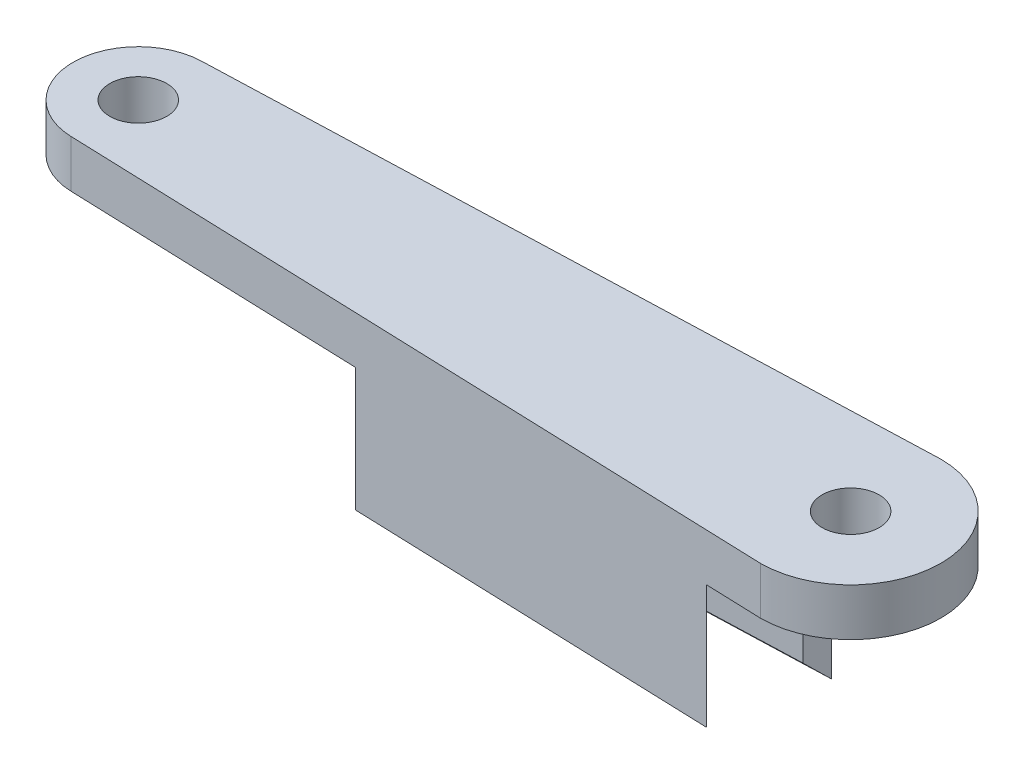
ISO-10303-21;
HEADER;
FILE_DESCRIPTION(('STEP AP214'),'2;1');
FILE_NAME('part.step','',(''),(''),'','','');
FILE_SCHEMA(('AUTOMOTIVE_DESIGN { 1 0 10303 214 1 1 1 1 }'));
ENDSEC;
DATA;
#1=APPLICATION_CONTEXT('core data for automotive mechanical design processes');
#2=APPLICATION_PROTOCOL_DEFINITION('international standard','automotive_design',2000,#1);
#3=PRODUCT_CONTEXT('',#1,'mechanical');
#4=PRODUCT('Part','Part','',(#3));
#5=PRODUCT_RELATED_PRODUCT_CATEGORY('part','',(#4));
#6=PRODUCT_DEFINITION_FORMATION('','',#4);
#7=PRODUCT_DEFINITION_CONTEXT('part definition',#1,'design');
#8=PRODUCT_DEFINITION('design','',#6,#7);
#9=PRODUCT_DEFINITION_SHAPE('','',#8);
#10=(LENGTH_UNIT() NAMED_UNIT(*) SI_UNIT(.MILLI.,.METRE.));
#11=(NAMED_UNIT(*) PLANE_ANGLE_UNIT() SI_UNIT($,.RADIAN.));
#12=(NAMED_UNIT(*) SI_UNIT($,.STERADIAN.) SOLID_ANGLE_UNIT());
#13=UNCERTAINTY_MEASURE_WITH_UNIT(LENGTH_MEASURE(1.E-05),#10,'distance_accuracy_value','');
#14=(GEOMETRIC_REPRESENTATION_CONTEXT(3) GLOBAL_UNCERTAINTY_ASSIGNED_CONTEXT((#13)) GLOBAL_UNIT_ASSIGNED_CONTEXT((#10,
#11,#12)) REPRESENTATION_CONTEXT('',''));
#15=CARTESIAN_POINT('',(0.,0.,0.));
#16=DIRECTION('',(0.,0.,1.));
#17=DIRECTION('',(1.,0.,0.));
#18=AXIS2_PLACEMENT_3D('',#15,#16,#17);
#19=CARTESIAN_POINT('',(-0.489400484406654,-36.,-13.9828709830458));
#20=DIRECTION('',(0.0349785821756223,0.,0.999388062160532));
#21=DIRECTION('',(0.999388062160532,0.,-0.0349785821756223));
#22=AXIS2_PLACEMENT_3D('',#19,#20,#21);
#23=PLANE('',#22);
#24=DIRECTION('',(0.,1.,0.));
#25=VECTOR('',#24,1.);
#26=CARTESIAN_POINT('',(-88.3106967523624,-36.,-10.909125613667));
#27=LINE('',#26,#25);
#28=CARTESIAN_POINT('',(-88.3106967523624,-26.,-10.909125613667));
#29=VERTEX_POINT('',#28);
#30=CARTESIAN_POINT('',(-88.3106967523625,-10.,-10.909125613667));
#31=VERTEX_POINT('',#30);
#32=EDGE_CURVE('E183',#29,#31,#27,.T.);
#33=ORIENTED_EDGE('',*,*,#32,.F.);
#34=DIRECTION('',(-0.999388062160532,0.,0.0349785821756223));
#35=VECTOR('',#34,1.);
#36=CARTESIAN_POINT('',(-128.845411023626,-26.,-9.49041061417262));
#37=LINE('',#36,#35);
#38=CARTESIAN_POINT('',(-17.4566378695959,-26.,-13.3890176745641));
#39=VERTEX_POINT('',#38);
#40=EDGE_CURVE('E209',#39,#29,#37,.T.);
#41=ORIENTED_EDGE('',*,*,#40,.F.);
#42=DIRECTION('',(0.,1.,0.));
#43=VECTOR('',#42,1.);
#44=CARTESIAN_POINT('',(-17.4566378695959,-36.,-13.3890176745641));
#45=LINE('',#44,#43);
#46=CARTESIAN_POINT('',(-17.4566378695959,-10.,-13.3890176745641));
#47=VERTEX_POINT('',#46);
#48=EDGE_CURVE('E261',#39,#47,#45,.T.);
#49=ORIENTED_EDGE('',*,*,#48,.T.);
#50=DIRECTION('',(0.999388062160532,0.,-0.0349785821756223));
#51=VECTOR('',#50,1.);
#52=CARTESIAN_POINT('',(-0.489400484406654,-10.,-13.9828709830458));
#53=LINE('',#52,#51);
#54=EDGE_CURVE('E253',#31,#47,#53,.T.);
#55=ORIENTED_EDGE('',*,*,#54,.F.);
#56=EDGE_LOOP('',(#33,#41,#49,#55));
#57=FACE_BOUND('',#56,.T.);
#58=ADVANCED_FACE('F49',(#57),#23,.T.);
#59=CARTESIAN_POINT('',(-150.,5.,0.));
#60=DIRECTION('',(0.,-1.,0.));
#61=DIRECTION('',(0.,0.,-1.));
#62=AXIS2_PLACEMENT_3D('',#59,#60,#61);
#63=CYLINDRICAL_SURFACE('',#62,13.7415858547073);
#64=CARTESIAN_POINT('',(-150.,-10.,0.));
#65=DIRECTION('',(0.,1.,0.));
#66=DIRECTION('',(0.,0.,1.));
#67=AXIS2_PLACEMENT_3D('',#64,#65,#66);
#68=CIRCLE('',#67,13.7415858547073);
#69=CARTESIAN_POINT('',(-150.480661190042,-10.,13.7331768583486));
#70=VERTEX_POINT('',#69);
#71=CARTESIAN_POINT('',(-150.480661190042,-10.,-13.7331768583486));
#72=VERTEX_POINT('',#71);
#73=EDGE_CURVE('E171',#70,#72,#68,.F.);
#74=ORIENTED_EDGE('',*,*,#73,.F.);
#75=DIRECTION('',(0.,-1.,0.));
#76=VECTOR('',#75,1.);
#77=CARTESIAN_POINT('',(-150.480661190042,5.,13.7331768583486));
#78=LINE('',#77,#76);
#79=CARTESIAN_POINT('',(-150.480661190042,0.,13.7331768583486));
#80=VERTEX_POINT('',#79);
#81=EDGE_CURVE('E224',#80,#70,#78,.T.);
#82=ORIENTED_EDGE('',*,*,#81,.F.);
#83=CARTESIAN_POINT('',(-150.,0.,0.));
#84=DIRECTION('',(0.,1.,0.));
#85=DIRECTION('',(0.,0.,1.));
#86=AXIS2_PLACEMENT_3D('',#83,#84,#85);
#87=CIRCLE('',#86,13.7415858547073);
#88=CARTESIAN_POINT('',(-150.480661190042,0.,-13.7331768583486));
#89=VERTEX_POINT('',#88);
#90=EDGE_CURVE('E229',#80,#89,#87,.F.);
#91=ORIENTED_EDGE('',*,*,#90,.T.);
#92=DIRECTION('',(0.,-1.,0.));
#93=VECTOR('',#92,1.);
#94=CARTESIAN_POINT('',(-150.480661190042,5.,-13.7331768583486));
#95=LINE('',#94,#93);
#96=EDGE_CURVE('E221',#89,#72,#95,.T.);
#97=ORIENTED_EDGE('',*,*,#96,.T.);
#98=EDGE_LOOP('',(#74,#82,#91,#97));
#99=FACE_BOUND('',#98,.T.);
#100=ADVANCED_FACE('F343',(#99),#63,.T.);
#101=CARTESIAN_POINT('',(0.,-36.,0.));
#102=DIRECTION('',(0.,-1.,0.));
#103=DIRECTION('',(0.,0.,-1.));
#104=AXIS2_PLACEMENT_3D('',#101,#102,#103);
#105=PLANE('',#104);
#106=DIRECTION('',(0.,0.,1.));
#107=VECTOR('',#106,1.);
#108=CARTESIAN_POINT('',(-88.3106967523624,-36.,0.));
#109=LINE('',#108,#107);
#110=CARTESIAN_POINT('',(-88.3106967523624,-36.,10.909125613667));
#111=VERTEX_POINT('',#110);
#112=CARTESIAN_POINT('',(-88.3106967523624,-36.,15.9091256136673));
#113=VERTEX_POINT('',#112);
#114=EDGE_CURVE('E200',#111,#113,#109,.T.);
#115=ORIENTED_EDGE('',*,*,#114,.F.);
#116=DIRECTION('',(0.999388062160532,0.,0.0349785821756221));
#117=VECTOR('',#116,1.);
#118=CARTESIAN_POINT('',(-0.48940048440665,-36.,13.9828709830458));
#119=LINE('',#118,#117);
#120=CARTESIAN_POINT('',(-17.4566378695959,-36.,13.3890176745641));
#121=VERTEX_POINT('',#120);
#122=EDGE_CURVE('E235',#111,#121,#119,.T.);
#123=ORIENTED_EDGE('',*,*,#122,.T.);
#124=CARTESIAN_POINT('',(0.,-36.,0.));
#125=DIRECTION('',(0.,-1.,0.));
#126=DIRECTION('',(0.,0.,-1.));
#127=AXIS2_PLACEMENT_3D('',#124,#125,#126);
#128=CIRCLE('',#127,22.);
#129=CARTESIAN_POINT('',(-11.7678187902949,-36.,18.5881263423397));
#130=VERTEX_POINT('',#129);
#131=EDGE_CURVE('E238',#121,#130,#128,.F.);
#132=ORIENTED_EDGE('',*,*,#131,.T.);
#133=DIRECTION('',(-0.999388062160532,0.,-0.0349785821756185));
#134=VECTOR('',#133,1.);
#135=CARTESIAN_POINT('',(-0.664186371694671,-36.,18.9767534769907));
#136=LINE('',#135,#134);
#137=EDGE_CURVE('E232',#130,#113,#136,.T.);
#138=ORIENTED_EDGE('',*,*,#137,.T.);
#139=EDGE_LOOP('',(#115,#123,#132,#138));
#140=FACE_BOUND('',#139,.T.);
#141=ADVANCED_FACE('F335',(#140),#105,.T.);
#142=CARTESIAN_POINT('',(0.,-10.,0.));
#143=DIRECTION('',(0.,1.,0.));
#144=DIRECTION('',(0.,0.,1.));
#145=AXIS2_PLACEMENT_3D('',#142,#143,#144);
#146=PLANE('',#145);
#147=DIRECTION('',(0.,0.,1.));
#148=VECTOR('',#147,1.);
#149=CARTESIAN_POINT('',(-88.3106967523625,-10.,-19.));
#150=LINE('',#149,#148);
#151=CARTESIAN_POINT('',(-88.3106967523625,-10.,-15.9091256136673));
#152=VERTEX_POINT('',#151);
#153=EDGE_CURVE('E168',#152,#31,#150,.T.);
#154=ORIENTED_EDGE('',*,*,#153,.T.);
#155=ORIENTED_EDGE('',*,*,#54,.T.);
#156=CARTESIAN_POINT('',(0.,-10.,0.));
#157=DIRECTION('',(0.,-1.,0.));
#158=DIRECTION('',(0.,0.,-1.));
#159=AXIS2_PLACEMENT_3D('',#156,#157,#158);
#160=CIRCLE('',#159,22.);
#161=CARTESIAN_POINT('',(-11.7678187902949,-10.,-18.5881263423397));
#162=VERTEX_POINT('',#161);
#163=EDGE_CURVE('E248',#47,#162,#160,.T.);
#164=ORIENTED_EDGE('',*,*,#163,.T.);
#165=DIRECTION('',(0.999388062160532,0.,-0.0349785821756187));
#166=VECTOR('',#165,1.);
#167=CARTESIAN_POINT('',(-0.664186371694676,-10.,-18.9767534769907));
#168=LINE('',#167,#166);
#169=CARTESIAN_POINT('',(0.,-10.,-19.));
#170=VERTEX_POINT('',#169);
#171=EDGE_CURVE('E266',#162,#170,#168,.T.);
#172=ORIENTED_EDGE('',*,*,#171,.T.);
#173=CARTESIAN_POINT('',(0.,-10.,0.));
#174=DIRECTION('',(0.,1.,0.));
#175=DIRECTION('',(0.,0.,1.));
#176=AXIS2_PLACEMENT_3D('',#173,#174,#175);
#177=CIRCLE('',#176,19.);
#178=CARTESIAN_POINT('',(0.,-10.,19.));
#179=VERTEX_POINT('',#178);
#180=EDGE_CURVE('E271',#179,#170,#177,.T.);
#181=ORIENTED_EDGE('',*,*,#180,.F.);
#182=DIRECTION('',(0.999388062160532,0.,0.0349785821756185));
#183=VECTOR('',#182,1.);
#184=CARTESIAN_POINT('',(-0.664186371694671,-10.,18.9767534769907));
#185=LINE('',#184,#183);
#186=CARTESIAN_POINT('',(-11.7678187902949,-10.,18.5881263423397));
#187=VERTEX_POINT('',#186);
#188=EDGE_CURVE('E268',#187,#179,#185,.T.);
#189=ORIENTED_EDGE('',*,*,#188,.F.);
#190=CARTESIAN_POINT('',(0.,-10.,0.));
#191=DIRECTION('',(0.,-1.,0.));
#192=DIRECTION('',(0.,0.,-1.));
#193=AXIS2_PLACEMENT_3D('',#190,#191,#192);
#194=CIRCLE('',#193,22.);
#195=CARTESIAN_POINT('',(-17.4566378695959,-10.,13.3890176745641));
#196=VERTEX_POINT('',#195);
#197=EDGE_CURVE('E236',#196,#187,#194,.F.);
#198=ORIENTED_EDGE('',*,*,#197,.F.);
#199=DIRECTION('',(0.999388062160532,0.,0.0349785821756221));
#200=VECTOR('',#199,1.);
#201=CARTESIAN_POINT('',(-0.48940048440665,-10.,13.9828709830458));
#202=LINE('',#201,#200);
#203=CARTESIAN_POINT('',(-88.3106967523625,-10.,10.909125613667));
#204=VERTEX_POINT('',#203);
#205=EDGE_CURVE('E231',#204,#196,#202,.T.);
#206=ORIENTED_EDGE('',*,*,#205,.F.);
#207=CARTESIAN_POINT('',(-88.3106967523625,-10.,15.9091256136673));
#208=VERTEX_POINT('',#207);
#209=EDGE_CURVE('E184',#204,#208,#150,.T.);
#210=ORIENTED_EDGE('',*,*,#209,.T.);
#211=DIRECTION('',(0.999388062160532,0.,0.0349785821756185));
#212=VECTOR('',#211,1.);
#213=CARTESIAN_POINT('',(-0.664186371694671,-10.,18.9767534769907));
#214=LINE('',#213,#212);
#215=EDGE_CURVE('E177',#70,#208,#214,.T.);
#216=ORIENTED_EDGE('',*,*,#215,.F.);
#217=ORIENTED_EDGE('',*,*,#73,.T.);
#218=DIRECTION('',(0.999388062160532,0.,-0.0349785821756187));
#219=VECTOR('',#218,1.);
#220=CARTESIAN_POINT('',(-0.664186371694676,-10.,-18.9767534769907));
#221=LINE('',#220,#219);
#222=EDGE_CURVE('E164',#72,#152,#221,.T.);
#223=ORIENTED_EDGE('',*,*,#222,.T.);
#224=EDGE_LOOP('',(#154,#155,#164,#172,#181,#189,#198,#206,#210,#216,#217,#223));
#225=FACE_BOUND('',#224,.T.);
#226=CARTESIAN_POINT('',(0.,-10.,0.));
#227=DIRECTION('',(0.,1.,0.));
#228=DIRECTION('',(0.,0.,1.));
#229=AXIS2_PLACEMENT_3D('',#226,#227,#228);
#230=CIRCLE('',#229,6.);
#231=CARTESIAN_POINT('',(0.,-10.,6.));
#232=VERTEX_POINT('',#231);
#233=EDGE_CURVE('E286',#232,#232,#230,.T.);
#234=ORIENTED_EDGE('',*,*,#233,.T.);
#235=EDGE_LOOP('',(#234));
#236=FACE_BOUND('',#235,.T.);
#237=CARTESIAN_POINT('',(-150.,-10.,0.));
#238=DIRECTION('',(0.,-1.,0.));
#239=DIRECTION('',(0.,0.,-1.));
#240=AXIS2_PLACEMENT_3D('',#237,#238,#239);
#241=CIRCLE('',#240,6.00000000000002);
#242=CARTESIAN_POINT('',(-150.,-10.,-6.00000000000003));
#243=VERTEX_POINT('',#242);
#244=EDGE_CURVE('E218',#243,#243,#241,.T.);
#245=ORIENTED_EDGE('',*,*,#244,.F.);
#246=EDGE_LOOP('',(#245));
#247=FACE_BOUND('',#246,.T.);
#248=ADVANCED_FACE('F166',(#225,#236,#247),#146,.F.);
#249=CARTESIAN_POINT('',(0.,0.,0.));
#250=DIRECTION('',(0.,1.,0.));
#251=DIRECTION('',(0.,0.,1.));
#252=AXIS2_PLACEMENT_3D('',#249,#250,#251);
#253=PLANE('',#252);
#254=CARTESIAN_POINT('',(-150.,0.,0.));
#255=DIRECTION('',(0.,1.,0.));
#256=DIRECTION('',(0.,0.,1.));
#257=AXIS2_PLACEMENT_3D('',#254,#255,#256);
#258=CIRCLE('',#257,6.00000000000002);
#259=CARTESIAN_POINT('',(-150.,0.,6.));
#260=VERTEX_POINT('',#259);
#261=EDGE_CURVE('E176',#260,#260,#258,.F.);
#262=ORIENTED_EDGE('',*,*,#261,.T.);
#263=EDGE_LOOP('',(#262));
#264=FACE_BOUND('',#263,.T.);
#265=ORIENTED_EDGE('',*,*,#90,.F.);
#266=DIRECTION('',(0.999388062160532,0.,0.0349785821756185));
#267=VECTOR('',#266,1.);
#268=CARTESIAN_POINT('',(-0.664186371694671,0.,18.9767534769907));
#269=LINE('',#268,#267);
#270=CARTESIAN_POINT('',(0.,0.,19.));
#271=VERTEX_POINT('',#270);
#272=EDGE_CURVE('E276',#80,#271,#269,.T.);
#273=ORIENTED_EDGE('',*,*,#272,.T.);
#274=CARTESIAN_POINT('',(0.,0.,0.));
#275=DIRECTION('',(0.,1.,0.));
#276=DIRECTION('',(0.,0.,1.));
#277=AXIS2_PLACEMENT_3D('',#274,#275,#276);
#278=CIRCLE('',#277,19.);
#279=CARTESIAN_POINT('',(0.,0.,-19.));
#280=VERTEX_POINT('',#279);
#281=EDGE_CURVE('E269',#271,#280,#278,.T.);
#282=ORIENTED_EDGE('',*,*,#281,.T.);
#283=DIRECTION('',(0.999388062160532,0.,-0.0349785821756187));
#284=VECTOR('',#283,1.);
#285=CARTESIAN_POINT('',(-0.664186371694676,0.,-18.9767534769907));
#286=LINE('',#285,#284);
#287=EDGE_CURVE('E265',#89,#280,#286,.T.);
#288=ORIENTED_EDGE('',*,*,#287,.F.);
#289=EDGE_LOOP('',(#265,#273,#282,#288));
#290=FACE_BOUND('',#289,.T.);
#291=CARTESIAN_POINT('',(0.,0.,0.));
#292=DIRECTION('',(0.,1.,0.));
#293=DIRECTION('',(0.,0.,1.));
#294=AXIS2_PLACEMENT_3D('',#291,#292,#293);
#295=CIRCLE('',#294,6.);
#296=CARTESIAN_POINT('',(0.,0.,6.));
#297=VERTEX_POINT('',#296);
#298=EDGE_CURVE('E283',#297,#297,#295,.T.);
#299=ORIENTED_EDGE('',*,*,#298,.F.);
#300=EDGE_LOOP('',(#299));
#301=FACE_BOUND('',#300,.T.);
#302=ADVANCED_FACE('F346',(#264,#290,#301),#253,.T.);
#303=CARTESIAN_POINT('',(0.,-10.,0.));
#304=DIRECTION('',(0.,1.,0.));
#305=DIRECTION('',(0.,0.,1.));
#306=AXIS2_PLACEMENT_3D('',#303,#304,#305);
#307=CYLINDRICAL_SURFACE('',#306,6.);
#308=ORIENTED_EDGE('',*,*,#233,.F.);
#309=EDGE_LOOP('',(#308));
#310=FACE_BOUND('',#309,.T.);
#311=ORIENTED_EDGE('',*,*,#298,.T.);
#312=EDGE_LOOP('',(#311));
#313=FACE_BOUND('',#312,.T.);
#314=ADVANCED_FACE('F374',(#310,#313),#307,.F.);
#315=CARTESIAN_POINT('',(-0.664186371694676,-10.,-18.9767534769907));
#316=DIRECTION('',(0.0349785821756187,0.,0.999388062160532));
#317=DIRECTION('',(0.999388062160532,0.,-0.0349785821756187));
#318=AXIS2_PLACEMENT_3D('',#315,#316,#317);
#319=PLANE('',#318);
#320=DIRECTION('',(0.,1.,0.));
#321=VECTOR('',#320,1.);
#322=CARTESIAN_POINT('',(-88.3106967523625,-10.,-15.9091256136673));
#323=LINE('',#322,#321);
#324=CARTESIAN_POINT('',(-88.3106967523624,-36.,-15.9091256136673));
#325=VERTEX_POINT('',#324);
#326=EDGE_CURVE('E180',#325,#152,#323,.T.);
#327=ORIENTED_EDGE('',*,*,#326,.T.);
#328=ORIENTED_EDGE('',*,*,#222,.F.);
#329=ORIENTED_EDGE('',*,*,#96,.F.);
#330=ORIENTED_EDGE('',*,*,#287,.T.);
#331=DIRECTION('',(0.,1.,0.));
#332=VECTOR('',#331,1.);
#333=CARTESIAN_POINT('',(0.,-10.,-19.));
#334=LINE('',#333,#332);
#335=EDGE_CURVE('E280',#170,#280,#334,.T.);
#336=ORIENTED_EDGE('',*,*,#335,.F.);
#337=ORIENTED_EDGE('',*,*,#171,.F.);
#338=DIRECTION('',(0.,1.,0.));
#339=VECTOR('',#338,1.);
#340=CARTESIAN_POINT('',(-11.7678187902949,-36.,-18.5881263423397));
#341=LINE('',#340,#339);
#342=CARTESIAN_POINT('',(-11.7678187902949,-36.,-18.5881263423397));
#343=VERTEX_POINT('',#342);
#344=EDGE_CURVE('E256',#343,#162,#341,.T.);
#345=ORIENTED_EDGE('',*,*,#344,.F.);
#346=DIRECTION('',(0.999388062160532,0.,-0.0349785821756187));
#347=VECTOR('',#346,1.);
#348=CARTESIAN_POINT('',(-0.664186371694676,-36.,-18.9767534769907));
#349=LINE('',#348,#347);
#350=EDGE_CURVE('E189',#325,#343,#349,.T.);
#351=ORIENTED_EDGE('',*,*,#350,.F.);
#352=EDGE_LOOP('',(#327,#328,#329,#330,#336,#337,#345,#351));
#353=FACE_BOUND('',#352,.T.);
#354=ADVANCED_FACE('F187',(#353),#319,.F.);
#355=CARTESIAN_POINT('',(0.,-10.,0.));
#356=DIRECTION('',(0.,1.,0.));
#357=DIRECTION('',(0.,0.,1.));
#358=AXIS2_PLACEMENT_3D('',#355,#356,#357);
#359=CYLINDRICAL_SURFACE('',#358,19.);
#360=ORIENTED_EDGE('',*,*,#281,.F.);
#361=DIRECTION('',(0.,1.,0.));
#362=VECTOR('',#361,1.);
#363=CARTESIAN_POINT('',(0.,-10.,19.));
#364=LINE('',#363,#362);
#365=EDGE_CURVE('E274',#179,#271,#364,.T.);
#366=ORIENTED_EDGE('',*,*,#365,.F.);
#367=ORIENTED_EDGE('',*,*,#180,.T.);
#368=ORIENTED_EDGE('',*,*,#335,.T.);
#369=EDGE_LOOP('',(#360,#366,#367,#368));
#370=FACE_BOUND('',#369,.T.);
#371=ADVANCED_FACE('F352',(#370),#359,.T.);
#372=CARTESIAN_POINT('',(-0.664186371694671,-10.,18.9767534769907));
#373=DIRECTION('',(-0.0349785821756185,0.,0.999388062160532));
#374=DIRECTION('',(0.999388062160532,0.,0.0349785821756185));
#375=AXIS2_PLACEMENT_3D('',#372,#373,#374);
#376=PLANE('',#375);
#377=ORIENTED_EDGE('',*,*,#215,.T.);
#378=DIRECTION('',(0.,1.,0.));
#379=VECTOR('',#378,1.);
#380=CARTESIAN_POINT('',(-88.3106967523625,-10.,15.9091256136673));
#381=LINE('',#380,#379);
#382=EDGE_CURVE('E202',#113,#208,#381,.T.);
#383=ORIENTED_EDGE('',*,*,#382,.F.);
#384=ORIENTED_EDGE('',*,*,#137,.F.);
#385=DIRECTION('',(0.,1.,0.));
#386=VECTOR('',#385,1.);
#387=CARTESIAN_POINT('',(-11.7678187902949,-36.,18.5881263423397));
#388=LINE('',#387,#386);
#389=EDGE_CURVE('E240',#130,#187,#388,.T.);
#390=ORIENTED_EDGE('',*,*,#389,.T.);
#391=ORIENTED_EDGE('',*,*,#188,.T.);
#392=ORIENTED_EDGE('',*,*,#365,.T.);
#393=ORIENTED_EDGE('',*,*,#272,.F.);
#394=ORIENTED_EDGE('',*,*,#81,.T.);
#395=EDGE_LOOP('',(#377,#383,#384,#390,#391,#392,#393,#394));
#396=FACE_BOUND('',#395,.T.);
#397=ADVANCED_FACE('F339',(#396),#376,.T.);
#398=CARTESIAN_POINT('',(0.,-36.,0.));
#399=DIRECTION('',(0.,1.,0.));
#400=DIRECTION('',(0.,0.,1.));
#401=AXIS2_PLACEMENT_3D('',#398,#399,#400);
#402=CYLINDRICAL_SURFACE('',#401,22.);
#403=ORIENTED_EDGE('',*,*,#163,.F.);
#404=ORIENTED_EDGE('',*,*,#48,.F.);
#405=CARTESIAN_POINT('',(-17.4566378695959,-36.,-13.3890176745641));
#406=VERTEX_POINT('',#405);
#407=EDGE_CURVE('E262',#406,#39,#45,.T.);
#408=ORIENTED_EDGE('',*,*,#407,.F.);
#409=CARTESIAN_POINT('',(0.,-36.,0.));
#410=DIRECTION('',(0.,-1.,0.));
#411=DIRECTION('',(0.,0.,-1.));
#412=AXIS2_PLACEMENT_3D('',#409,#410,#411);
#413=CIRCLE('',#412,22.);
#414=EDGE_CURVE('E249',#406,#343,#413,.T.);
#415=ORIENTED_EDGE('',*,*,#414,.T.);
#416=ORIENTED_EDGE('',*,*,#344,.T.);
#417=EDGE_LOOP('',(#403,#404,#408,#415,#416));
#418=FACE_BOUND('',#417,.T.);
#419=ADVANCED_FACE('F311',(#418),#402,.F.);
#420=CARTESIAN_POINT('',(0.,-36.,0.));
#421=DIRECTION('',(0.,-1.,0.));
#422=DIRECTION('',(0.,0.,-1.));
#423=AXIS2_PLACEMENT_3D('',#420,#421,#422);
#424=PLANE('',#423);
#425=DIRECTION('',(0.,0.,1.));
#426=VECTOR('',#425,1.);
#427=CARTESIAN_POINT('',(-88.3106967523624,-36.,0.));
#428=LINE('',#427,#426);
#429=CARTESIAN_POINT('',(-88.3106967523624,-36.,-10.909125613667));
#430=VERTEX_POINT('',#429);
#431=EDGE_CURVE('E190',#325,#430,#428,.T.);
#432=ORIENTED_EDGE('',*,*,#431,.F.);
#433=ORIENTED_EDGE('',*,*,#350,.T.);
#434=ORIENTED_EDGE('',*,*,#414,.F.);
#435=DIRECTION('',(0.999388062160532,0.,-0.0349785821756223));
#436=VECTOR('',#435,1.);
#437=CARTESIAN_POINT('',(-0.489400484406654,-36.,-13.9828709830458));
#438=LINE('',#437,#436);
#439=EDGE_CURVE('E252',#430,#406,#438,.T.);
#440=ORIENTED_EDGE('',*,*,#439,.F.);
#441=EDGE_LOOP('',(#432,#433,#434,#440));
#442=FACE_BOUND('',#441,.T.);
#443=ADVANCED_FACE('F307',(#442),#424,.T.);
#444=CARTESIAN_POINT('',(-0.48940048440665,-36.,13.9828709830458));
#445=DIRECTION('',(-0.0349785821756221,0.,0.999388062160532));
#446=DIRECTION('',(0.999388062160532,0.,0.0349785821756221));
#447=AXIS2_PLACEMENT_3D('',#444,#445,#446);
#448=PLANE('',#447);
#449=ORIENTED_EDGE('',*,*,#122,.F.);
#450=DIRECTION('',(0.,1.,0.));
#451=VECTOR('',#450,1.);
#452=CARTESIAN_POINT('',(-88.3106967523624,-36.,10.909125613667));
#453=LINE('',#452,#451);
#454=EDGE_CURVE('E192',#111,#204,#453,.T.);
#455=ORIENTED_EDGE('',*,*,#454,.T.);
#456=ORIENTED_EDGE('',*,*,#205,.T.);
#457=DIRECTION('',(0.,1.,0.));
#458=VECTOR('',#457,1.);
#459=CARTESIAN_POINT('',(-17.4566378695959,-36.,13.3890176745641));
#460=LINE('',#459,#458);
#461=EDGE_CURVE('E245',#121,#196,#460,.T.);
#462=ORIENTED_EDGE('',*,*,#461,.F.);
#463=EDGE_LOOP('',(#449,#455,#456,#462));
#464=FACE_BOUND('',#463,.T.);
#465=ADVANCED_FACE('F331',(#464),#448,.F.);
#466=CARTESIAN_POINT('',(0.,-36.,0.));
#467=DIRECTION('',(0.,1.,0.));
#468=DIRECTION('',(0.,0.,1.));
#469=AXIS2_PLACEMENT_3D('',#466,#467,#468);
#470=CYLINDRICAL_SURFACE('',#469,22.);
#471=ORIENTED_EDGE('',*,*,#197,.T.);
#472=ORIENTED_EDGE('',*,*,#389,.F.);
#473=ORIENTED_EDGE('',*,*,#131,.F.);
#474=ORIENTED_EDGE('',*,*,#461,.T.);
#475=EDGE_LOOP('',(#471,#472,#473,#474));
#476=FACE_BOUND('',#475,.T.);
#477=ADVANCED_FACE('F404',(#476),#470,.F.);
#478=CARTESIAN_POINT('',(-150.,0.000999999999999265,0.));
#479=DIRECTION('',(0.,-1.,0.));
#480=DIRECTION('',(0.,0.,-1.));
#481=AXIS2_PLACEMENT_3D('',#478,#479,#480);
#482=CYLINDRICAL_SURFACE('',#481,6.00000000000002);
#483=ORIENTED_EDGE('',*,*,#261,.F.);
#484=EDGE_LOOP('',(#483));
#485=FACE_BOUND('',#484,.T.);
#486=ORIENTED_EDGE('',*,*,#244,.T.);
#487=EDGE_LOOP('',(#486));
#488=FACE_BOUND('',#487,.T.);
#489=ADVANCED_FACE('F402',(#485,#488),#482,.F.);
#490=CARTESIAN_POINT('',(-128.740475277099,-26.,-6.49224642769102));
#491=DIRECTION('',(0.,-1.,0.));
#492=DIRECTION('',(0.,0.,-1.));
#493=AXIS2_PLACEMENT_3D('',#490,#491,#492);
#494=PLANE('',#493);
#495=ORIENTED_EDGE('',*,*,#40,.T.);
#496=DIRECTION('',(0.,0.,1.));
#497=VECTOR('',#496,1.);
#498=CARTESIAN_POINT('',(-88.3106967523624,-26.,-6.49224642769102));
#499=LINE('',#498,#497);
#500=CARTESIAN_POINT('',(-88.3106967523624,-26.,-7.90728867605696));
#501=VERTEX_POINT('',#500);
#502=EDGE_CURVE('E194',#29,#501,#499,.T.);
#503=ORIENTED_EDGE('',*,*,#502,.T.);
#504=DIRECTION('',(-0.999388062160532,0.,0.0349785821756223));
#505=VECTOR('',#504,1.);
#506=CARTESIAN_POINT('',(-128.740475277099,-26.,-6.49224642769102));
#507=LINE('',#506,#505);
#508=CARTESIAN_POINT('',(-20.3498663095506,-26.,-10.2859177415556));
#509=VERTEX_POINT('',#508);
#510=EDGE_CURVE('E206',#509,#501,#507,.T.);
#511=ORIENTED_EDGE('',*,*,#510,.F.);
#512=DIRECTION('',(0.681940483137919,0.,-0.731407668443271));
#513=VECTOR('',#512,1.);
#514=CARTESIAN_POINT('',(-20.3498663095506,-26.,-10.2859177415556));
#515=LINE('',#514,#513);
#516=EDGE_CURVE('E58',#509,#39,#515,.T.);
#517=ORIENTED_EDGE('',*,*,#516,.T.);
#518=EDGE_LOOP('',(#495,#503,#511,#517));
#519=FACE_BOUND('',#518,.T.);
#520=ADVANCED_FACE('F318',(#519),#494,.F.);
#521=CARTESIAN_POINT('',(-0.384464737879787,0.,-10.9847067965642));
#522=DIRECTION('',(0.0349785821756223,0.,0.999388062160532));
#523=DIRECTION('',(0.999388062160532,0.,-0.0349785821756223));
#524=AXIS2_PLACEMENT_3D('',#521,#522,#523);
#525=PLANE('',#524);
#526=DIRECTION('',(0.,1.,0.));
#527=VECTOR('',#526,1.);
#528=CARTESIAN_POINT('',(-88.3106967523625,0.,-7.90728867605696));
#529=LINE('',#528,#527);
#530=CARTESIAN_POINT('',(-88.3106967523624,-43.,-7.90728867605696));
#531=VERTEX_POINT('',#530);
#532=EDGE_CURVE('E319',#531,#501,#529,.T.);
#533=ORIENTED_EDGE('',*,*,#532,.F.);
#534=DIRECTION('',(0.999388062160532,0.,-0.0349785821756223));
#535=VECTOR('',#534,1.);
#536=CARTESIAN_POINT('',(-17.3517021230691,-43.,-10.3908534880825));
#537=LINE('',#536,#535);
#538=CARTESIAN_POINT('',(-20.3498663095506,-43.,-10.2859177415556));
#539=VERTEX_POINT('',#538);
#540=EDGE_CURVE('E72',#531,#539,#537,.T.);
#541=ORIENTED_EDGE('',*,*,#540,.T.);
#542=DIRECTION('',(0.,1.,0.));
#543=VECTOR('',#542,1.);
#544=CARTESIAN_POINT('',(-20.3498663095506,-26.,-10.2859177415556));
#545=LINE('',#544,#543);
#546=EDGE_CURVE('E292',#539,#509,#545,.T.);
#547=ORIENTED_EDGE('',*,*,#546,.T.);
#548=ORIENTED_EDGE('',*,*,#510,.T.);
#549=EDGE_LOOP('',(#533,#541,#547,#548));
#550=FACE_BOUND('',#549,.T.);
#551=ADVANCED_FACE('F316',(#550),#525,.T.);
#552=CARTESIAN_POINT('',(-0.489400484406654,0.,-13.9828709830458));
#553=DIRECTION('',(0.0349785821756223,0.,0.999388062160532));
#554=DIRECTION('',(0.999388062160532,0.,-0.0349785821756223));
#555=AXIS2_PLACEMENT_3D('',#552,#553,#554);
#556=PLANE('',#555);
#557=DIRECTION('',(0.999388062160532,0.,-0.0349785821756223));
#558=VECTOR('',#557,1.);
#559=CARTESIAN_POINT('',(-128.845411023626,-46.,-9.49041061417262));
#560=LINE('',#559,#558);
#561=CARTESIAN_POINT('',(-88.3106967523624,-46.,-10.909125613667));
#562=VERTEX_POINT('',#561);
#563=CARTESIAN_POINT('',(-17.4566378695959,-46.,-13.3890176745641));
#564=VERTEX_POINT('',#563);
#565=EDGE_CURVE('E210',#562,#564,#560,.T.);
#566=ORIENTED_EDGE('',*,*,#565,.F.);
#567=DIRECTION('',(0.,1.,0.));
#568=VECTOR('',#567,1.);
#569=CARTESIAN_POINT('',(-88.3106967523625,0.,-10.909125613667));
#570=LINE('',#569,#568);
#571=EDGE_CURVE('E64',#562,#430,#570,.T.);
#572=ORIENTED_EDGE('',*,*,#571,.T.);
#573=ORIENTED_EDGE('',*,*,#439,.T.);
#574=DIRECTION('',(0.,1.,0.));
#575=VECTOR('',#574,1.);
#576=CARTESIAN_POINT('',(-17.4566378695959,-36.,-13.3890176745641));
#577=LINE('',#576,#575);
#578=EDGE_CURVE('E212',#564,#406,#577,.T.);
#579=ORIENTED_EDGE('',*,*,#578,.F.);
#580=EDGE_LOOP('',(#566,#572,#573,#579));
#581=FACE_BOUND('',#580,.T.);
#582=ADVANCED_FACE('F302',(#581),#556,.F.);
#583=CARTESIAN_POINT('',(-0.384464737879787,-43.,-10.9847067965642));
#584=DIRECTION('',(0.0247335926526733,-0.70710678118655,0.706674075790592));
#585=DIRECTION('',(-0.999388062160532,0.,0.0349785821756223));
#586=AXIS2_PLACEMENT_3D('',#583,#584,#585);
#587=PLANE('',#586);
#588=DIRECTION('',(0.,0.706890329162381,0.70732316697299));
#589=VECTOR('',#588,1.);
#590=CARTESIAN_POINT('',(-88.3106967523624,-44.5387087719787,-9.44693961870703));
#591=LINE('',#590,#589);
#592=EDGE_CURVE('E11',#562,#531,#591,.T.);
#593=ORIENTED_EDGE('',*,*,#592,.F.);
#594=ORIENTED_EDGE('',*,*,#565,.T.);
#595=DIRECTION('',(-0.556802072878313,0.577350269189624,0.597191860548252));
#596=VECTOR('',#595,1.);
#597=CARTESIAN_POINT('',(-13.9276621373299,-49.6592088791177,-17.1739812837821));
#598=LINE('',#597,#596);
#599=EDGE_CURVE('E205',#539,#564,#598,.F.);
#600=ORIENTED_EDGE('',*,*,#599,.F.);
#601=ORIENTED_EDGE('',*,*,#540,.F.);
#602=EDGE_LOOP('',(#593,#594,#600,#601));
#603=FACE_BOUND('',#602,.T.);
#604=ADVANCED_FACE('F52',(#603),#587,.T.);
#605=CARTESIAN_POINT('',(-20.3498663095506,0.,-10.2859177415556));
#606=DIRECTION('',(0.731407668443271,0.,0.681940483137919));
#607=DIRECTION('',(0.,-1.,0.));
#608=AXIS2_PLACEMENT_3D('',#605,#606,#607);
#609=PLANE('',#608);
#610=ORIENTED_EDGE('',*,*,#578,.T.);
#611=ORIENTED_EDGE('',*,*,#407,.T.);
#612=ORIENTED_EDGE('',*,*,#516,.F.);
#613=ORIENTED_EDGE('',*,*,#546,.F.);
#614=ORIENTED_EDGE('',*,*,#599,.T.);
#615=EDGE_LOOP('',(#610,#611,#612,#613,#614));
#616=FACE_BOUND('',#615,.T.);
#617=ADVANCED_FACE('F297',(#616),#609,.T.);
#618=CARTESIAN_POINT('',(-88.3106967523625,-10.,-19.));
#619=DIRECTION('',(1.,0.,0.));
#620=DIRECTION('',(0.,1.,0.));
#621=AXIS2_PLACEMENT_3D('',#618,#619,#620);
#622=PLANE('',#621);
#623=ORIENTED_EDGE('',*,*,#32,.T.);
#624=ORIENTED_EDGE('',*,*,#153,.F.);
#625=ORIENTED_EDGE('',*,*,#326,.F.);
#626=ORIENTED_EDGE('',*,*,#431,.T.);
#627=ORIENTED_EDGE('',*,*,#571,.F.);
#628=ORIENTED_EDGE('',*,*,#592,.T.);
#629=ORIENTED_EDGE('',*,*,#532,.T.);
#630=ORIENTED_EDGE('',*,*,#502,.F.);
#631=EDGE_LOOP('',(#623,#624,#625,#626,#627,#628,#629,#630));
#632=FACE_BOUND('',#631,.T.);
#633=ADVANCED_FACE('F179',(#632),#622,.F.);
#634=ORIENTED_EDGE('',*,*,#382,.T.);
#635=ORIENTED_EDGE('',*,*,#209,.F.);
#636=ORIENTED_EDGE('',*,*,#454,.F.);
#637=ORIENTED_EDGE('',*,*,#114,.T.);
#638=EDGE_LOOP('',(#634,#635,#636,#637));
#639=FACE_BOUND('',#638,.T.);
#640=ADVANCED_FACE('F326',(#639),#622,.F.);
#641=CLOSED_SHELL('',(#58,#100,#141,#248,#302,#314,#354,#371,#397,#419,#443,#465,#477,#489,#520,
#551,#582,#604,#617,#633,#640));
#642=MANIFOLD_SOLID_BREP('B2',#641);
#643=ADVANCED_BREP_SHAPE_REPRESENTATION('',(#18,#642),#14);
#644=SHAPE_DEFINITION_REPRESENTATION(#9,#643);
ENDSEC;
END-ISO-10303-21;
